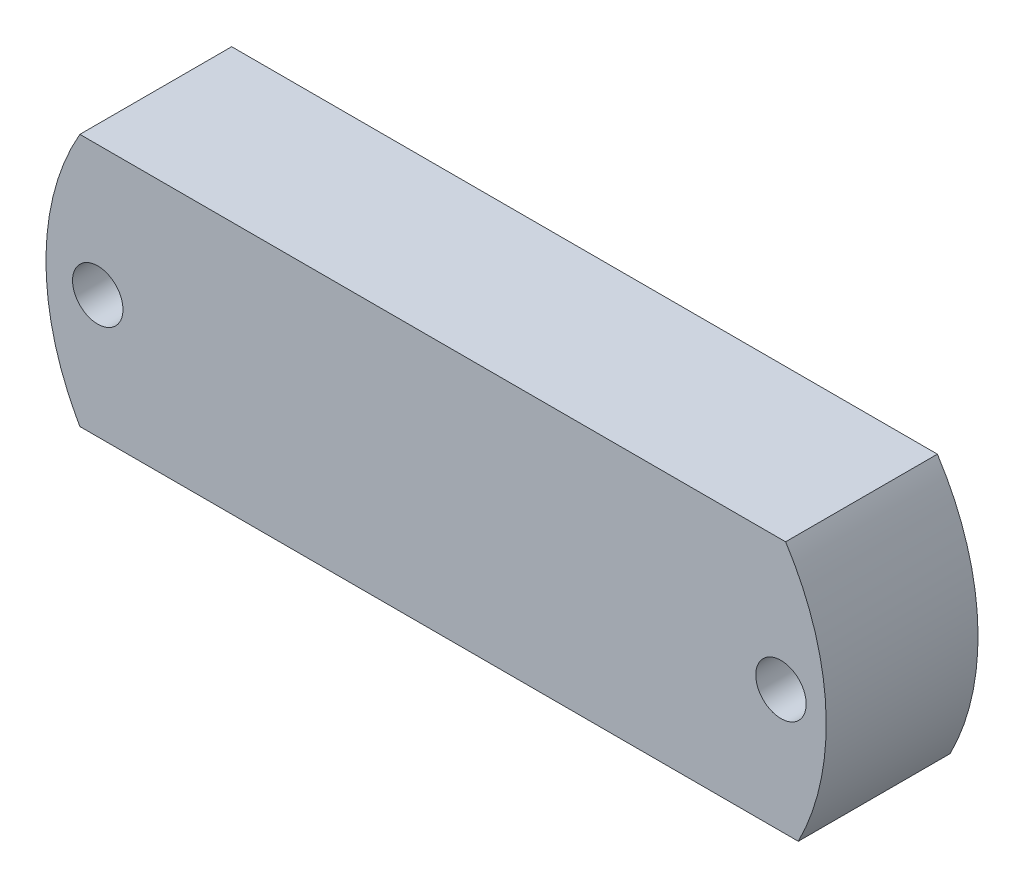
ISO-10303-21;
HEADER;
FILE_DESCRIPTION(('STEP AP214'),'2;1');
FILE_NAME('part.step','',(''),(''),'','','');
FILE_SCHEMA(('AUTOMOTIVE_DESIGN { 1 0 10303 214 1 1 1 1 }'));
ENDSEC;
DATA;
#1=APPLICATION_CONTEXT('core data for automotive mechanical design processes');
#2=APPLICATION_PROTOCOL_DEFINITION('international standard','automotive_design',2000,#1);
#3=PRODUCT_CONTEXT('',#1,'mechanical');
#4=PRODUCT('Part','Part','',(#3));
#5=PRODUCT_RELATED_PRODUCT_CATEGORY('part','',(#4));
#6=PRODUCT_DEFINITION_FORMATION('','',#4);
#7=PRODUCT_DEFINITION_CONTEXT('part definition',#1,'design');
#8=PRODUCT_DEFINITION('design','',#6,#7);
#9=PRODUCT_DEFINITION_SHAPE('','',#8);
#10=(LENGTH_UNIT() NAMED_UNIT(*) SI_UNIT(.MILLI.,.METRE.));
#11=(NAMED_UNIT(*) PLANE_ANGLE_UNIT() SI_UNIT($,.RADIAN.));
#12=(NAMED_UNIT(*) SI_UNIT($,.STERADIAN.) SOLID_ANGLE_UNIT());
#13=UNCERTAINTY_MEASURE_WITH_UNIT(LENGTH_MEASURE(1.E-05),#10,'distance_accuracy_value','');
#14=(GEOMETRIC_REPRESENTATION_CONTEXT(3) GLOBAL_UNCERTAINTY_ASSIGNED_CONTEXT((#13)) GLOBAL_UNIT_ASSIGNED_CONTEXT((#10,
#11,#12)) REPRESENTATION_CONTEXT('',''));
#15=CARTESIAN_POINT('',(0.,0.,0.));
#16=DIRECTION('',(0.,0.,1.));
#17=DIRECTION('',(1.,0.,0.));
#18=AXIS2_PLACEMENT_3D('',#15,#16,#17);
#19=CARTESIAN_POINT('',(0.,0.,11.43));
#20=DIRECTION('',(0.,0.,1.));
#21=DIRECTION('',(1.,0.,0.));
#22=AXIS2_PLACEMENT_3D('',#19,#20,#21);
#23=PLANE('',#22);
#24=CARTESIAN_POINT('',(16.9742327065846,45.0754732211039,11.43));
#25=DIRECTION('',(0.,0.,-1.));
#26=DIRECTION('',(1.,0.,0.));
#27=AXIS2_PLACEMENT_3D('',#24,#25,#26);
#28=CIRCLE('',#27,19.05);
#29=CARTESIAN_POINT('',(32.9659666202389,55.4276201691955,11.43));
#30=VERTEX_POINT('',#29);
#31=CARTESIAN_POINT('',(33.9226796055605,36.3776201691954,11.43));
#32=VERTEX_POINT('',#31);
#33=EDGE_CURVE('E123',#30,#32,#28,.T.);
#34=ORIENTED_EDGE('',*,*,#33,.F.);
#35=DIRECTION('',(1.,0.,0.));
#36=VECTOR('',#35,1.);
#37=CARTESIAN_POINT('',(-35.9792639425507,55.4276201691954,11.43));
#38=LINE('',#37,#36);
#39=CARTESIAN_POINT('',(-20.1644441300956,55.4276201691954,11.43));
#40=VERTEX_POINT('',#39);
#41=EDGE_CURVE('E156',#40,#30,#38,.T.);
#42=ORIENTED_EDGE('',*,*,#41,.F.);
#43=CARTESIAN_POINT('',(-3.66666018800201,45.9026201691955,11.43));
#44=DIRECTION('',(0.,0.,-1.));
#45=DIRECTION('',(-1.,0.,0.));
#46=AXIS2_PLACEMENT_3D('',#43,#44,#45);
#47=CIRCLE('',#46,19.05);
#48=CARTESIAN_POINT('',(-20.4868118319647,36.9591868981244,11.43));
#49=VERTEX_POINT('',#48);
#50=EDGE_CURVE('E67',#49,#40,#47,.T.);
#51=ORIENTED_EDGE('',*,*,#50,.F.);
#52=DIRECTION('',(0.484809620246332,-0.874619707139399,0.));
#53=VECTOR('',#52,1.);
#54=CARTESIAN_POINT('',(0.,0.,11.43));
#55=LINE('',#54,#53);
#56=CARTESIAN_POINT('',(-20.1644441300956,36.3776201691955,11.43));
#57=VERTEX_POINT('',#56);
#58=EDGE_CURVE('E171',#49,#57,#55,.T.);
#59=ORIENTED_EDGE('',*,*,#58,.T.);
#60=DIRECTION('',(-1.,0.,0.));
#61=VECTOR('',#60,1.);
#62=CARTESIAN_POINT('',(-20.1644441300956,36.3776201691954,11.43));
#63=LINE('',#62,#61);
#64=EDGE_CURVE('E153',#32,#57,#63,.T.);
#65=ORIENTED_EDGE('',*,*,#64,.F.);
#66=EDGE_LOOP('',(#34,#42,#51,#59,#65));
#67=FACE_BOUND('',#66,.T.);
#68=CARTESIAN_POINT('',(-18.81632,45.6249806854199,11.43));
#69=DIRECTION('',(0.,0.,-1.));
#70=DIRECTION('',(-1.,0.,0.));
#71=AXIS2_PLACEMENT_3D('',#68,#69,#70);
#72=CIRCLE('',#71,1.89864999999998);
#73=CARTESIAN_POINT('',(-20.71497,45.6249806854199,11.43));
#74=VERTEX_POINT('',#73);
#75=EDGE_CURVE('E188',#74,#74,#72,.T.);
#76=ORIENTED_EDGE('',*,*,#75,.T.);
#77=EDGE_LOOP('',(#76));
#78=FACE_BOUND('',#77,.T.);
#79=CARTESIAN_POINT('',(32.61868,45.6249806854199,11.43));
#80=DIRECTION('',(0.,0.,-1.));
#81=DIRECTION('',(-1.,0.,0.));
#82=AXIS2_PLACEMENT_3D('',#79,#80,#81);
#83=CIRCLE('',#82,1.89864999999999);
#84=CARTESIAN_POINT('',(30.72003,45.6249806854199,11.43));
#85=VERTEX_POINT('',#84);
#86=EDGE_CURVE('E180',#85,#85,#83,.T.);
#87=ORIENTED_EDGE('',*,*,#86,.T.);
#88=EDGE_LOOP('',(#87));
#89=FACE_BOUND('',#88,.T.);
#90=ADVANCED_FACE('F40',(#67,#78,#89),#23,.T.);
#91=CARTESIAN_POINT('',(0.,0.,0.));
#92=DIRECTION('',(0.,0.,1.));
#93=DIRECTION('',(1.,0.,0.));
#94=AXIS2_PLACEMENT_3D('',#91,#92,#93);
#95=PLANE('',#94);
#96=CARTESIAN_POINT('',(32.61868,45.6249806854199,0.));
#97=DIRECTION('',(0.,0.,-1.));
#98=DIRECTION('',(-1.,0.,0.));
#99=AXIS2_PLACEMENT_3D('',#96,#97,#98);
#100=CIRCLE('',#99,1.89864999999999);
#101=CARTESIAN_POINT('',(30.72003,45.6249806854199,0.));
#102=VERTEX_POINT('',#101);
#103=EDGE_CURVE('E174',#102,#102,#100,.T.);
#104=ORIENTED_EDGE('',*,*,#103,.F.);
#105=EDGE_LOOP('',(#104));
#106=FACE_BOUND('',#105,.T.);
#107=CARTESIAN_POINT('',(-18.81632,45.6249806854199,0.));
#108=DIRECTION('',(0.,0.,-1.));
#109=DIRECTION('',(-1.,0.,0.));
#110=AXIS2_PLACEMENT_3D('',#107,#108,#109);
#111=CIRCLE('',#110,1.89864999999999);
#112=CARTESIAN_POINT('',(-20.71497,45.6249806854199,0.));
#113=VERTEX_POINT('',#112);
#114=EDGE_CURVE('E184',#113,#113,#111,.T.);
#115=ORIENTED_EDGE('',*,*,#114,.F.);
#116=EDGE_LOOP('',(#115));
#117=FACE_BOUND('',#116,.T.);
#118=DIRECTION('',(1.,0.,0.));
#119=VECTOR('',#118,1.);
#120=CARTESIAN_POINT('',(-35.9792639425507,55.4276201691954,0.));
#121=LINE('',#120,#119);
#122=CARTESIAN_POINT('',(-20.1644441300956,55.4276201691954,0.));
#123=VERTEX_POINT('',#122);
#124=CARTESIAN_POINT('',(32.9659666202389,55.4276201691955,0.));
#125=VERTEX_POINT('',#124);
#126=EDGE_CURVE('E139',#123,#125,#121,.T.);
#127=ORIENTED_EDGE('',*,*,#126,.T.);
#128=CARTESIAN_POINT('',(16.9742327065846,45.0754732211039,0.));
#129=DIRECTION('',(0.,0.,-1.));
#130=DIRECTION('',(1.,0.,0.));
#131=AXIS2_PLACEMENT_3D('',#128,#129,#130);
#132=CIRCLE('',#131,19.05);
#133=CARTESIAN_POINT('',(33.9226796055605,36.3776201691954,0.));
#134=VERTEX_POINT('',#133);
#135=EDGE_CURVE('E59',#125,#134,#132,.T.);
#136=ORIENTED_EDGE('',*,*,#135,.T.);
#137=DIRECTION('',(-1.,0.,0.));
#138=VECTOR('',#137,1.);
#139=CARTESIAN_POINT('',(-20.1644441300956,36.3776201691954,0.));
#140=LINE('',#139,#138);
#141=CARTESIAN_POINT('',(27.53868,36.3776201691954,0.));
#142=VERTEX_POINT('',#141);
#143=EDGE_CURVE('E130',#134,#142,#140,.T.);
#144=ORIENTED_EDGE('',*,*,#143,.T.);
#145=DIRECTION('',(0.,-1.,0.));
#146=VECTOR('',#145,1.);
#147=CARTESIAN_POINT('',(27.53868,0.,0.));
#148=LINE('',#147,#146);
#149=CARTESIAN_POINT('',(27.53868,54.5149806854199,0.));
#150=VERTEX_POINT('',#149);
#151=EDGE_CURVE('E207',#150,#142,#148,.T.);
#152=ORIENTED_EDGE('',*,*,#151,.F.);
#153=DIRECTION('',(1.,0.,0.));
#154=VECTOR('',#153,1.);
#155=CARTESIAN_POINT('',(0.,54.5149806854199,0.));
#156=LINE('',#155,#154);
#157=CARTESIAN_POINT('',(-13.73632,54.5149806854199,0.));
#158=VERTEX_POINT('',#157);
#159=EDGE_CURVE('E11',#158,#150,#156,.T.);
#160=ORIENTED_EDGE('',*,*,#159,.F.);
#161=DIRECTION('',(0.,1.,0.));
#162=VECTOR('',#161,1.);
#163=CARTESIAN_POINT('',(-13.73632,0.,0.));
#164=LINE('',#163,#162);
#165=CARTESIAN_POINT('',(-13.73632,36.3776201691954,0.));
#166=VERTEX_POINT('',#165);
#167=EDGE_CURVE('E49',#166,#158,#164,.T.);
#168=ORIENTED_EDGE('',*,*,#167,.F.);
#169=CARTESIAN_POINT('',(-20.1644441300956,36.3776201691954,0.));
#170=VERTEX_POINT('',#169);
#171=EDGE_CURVE('E147',#166,#170,#140,.T.);
#172=ORIENTED_EDGE('',*,*,#171,.T.);
#173=DIRECTION('',(0.484809620246332,-0.874619707139399,0.));
#174=VECTOR('',#173,1.);
#175=CARTESIAN_POINT('',(0.,0.,0.));
#176=LINE('',#175,#174);
#177=CARTESIAN_POINT('',(-20.4868118319647,36.9591868981244,0.));
#178=VERTEX_POINT('',#177);
#179=EDGE_CURVE('E170',#178,#170,#176,.T.);
#180=ORIENTED_EDGE('',*,*,#179,.F.);
#181=CARTESIAN_POINT('',(-3.66666018800201,45.9026201691955,0.));
#182=DIRECTION('',(0.,0.,-1.));
#183=DIRECTION('',(-1.,0.,0.));
#184=AXIS2_PLACEMENT_3D('',#181,#182,#183);
#185=CIRCLE('',#184,19.05);
#186=EDGE_CURVE('E227',#178,#123,#185,.T.);
#187=ORIENTED_EDGE('',*,*,#186,.T.);
#188=EDGE_LOOP('',(#127,#136,#144,#152,#160,#168,#172,#180,#187));
#189=FACE_BOUND('',#188,.T.);
#190=ADVANCED_FACE('F42',(#106,#117,#189),#95,.F.);
#191=CARTESIAN_POINT('',(-13.73632,28.9424018104892,-2.20114598436374));
#192=DIRECTION('',(1.,0.,0.));
#193=DIRECTION('',(0.,1.,0.));
#194=AXIS2_PLACEMENT_3D('',#191,#192,#193);
#195=PLANE('',#194);
#196=DIRECTION('',(0.,0.,1.));
#197=VECTOR('',#196,1.);
#198=CARTESIAN_POINT('',(-13.73632,36.3776201691954,-2.20114598436374));
#199=LINE('',#198,#197);
#200=CARTESIAN_POINT('',(-13.73632,36.3776201691954,1.10922651046495));
#201=VERTEX_POINT('',#200);
#202=EDGE_CURVE('E168',#166,#201,#199,.T.);
#203=ORIENTED_EDGE('',*,*,#202,.F.);
#204=ORIENTED_EDGE('',*,*,#167,.T.);
#205=DIRECTION('',(0.,0.406736643075801,-0.913545457642601));
#206=VECTOR('',#205,1.);
#207=CARTESIAN_POINT('',(-13.73632,51.1022739765257,7.66506476672597));
#208=LINE('',#207,#206);
#209=CARTESIAN_POINT('',(-13.73632,51.1022739765257,7.66506476672597));
#210=VERTEX_POINT('',#209);
#211=EDGE_CURVE('E200',#210,#158,#208,.T.);
#212=ORIENTED_EDGE('',*,*,#211,.F.);
#213=DIRECTION('',(0.,-0.9135454576426,-0.406736643075801));
#214=VECTOR('',#213,1.);
#215=CARTESIAN_POINT('',(-13.73632,28.9424018104892,-2.20114598436374));
#216=LINE('',#215,#214);
#217=EDGE_CURVE('E192',#210,#201,#216,.T.);
#218=ORIENTED_EDGE('',*,*,#217,.T.);
#219=EDGE_LOOP('',(#203,#204,#212,#218));
#220=FACE_BOUND('',#219,.T.);
#221=ADVANCED_FACE('F213',(#220),#195,.T.);
#222=CARTESIAN_POINT('',(27.53868,28.9424018104892,-2.20114598436374));
#223=DIRECTION('',(-1.,0.,0.));
#224=DIRECTION('',(0.,0.,1.));
#225=AXIS2_PLACEMENT_3D('',#222,#223,#224);
#226=PLANE('',#225);
#227=DIRECTION('',(0.,0.,-1.));
#228=VECTOR('',#227,1.);
#229=CARTESIAN_POINT('',(27.53868,36.3776201691954,-2.20114598436374));
#230=LINE('',#229,#228);
#231=CARTESIAN_POINT('',(27.53868,36.3776201691954,1.10922651046495));
#232=VERTEX_POINT('',#231);
#233=EDGE_CURVE('E145',#232,#142,#230,.T.);
#234=ORIENTED_EDGE('',*,*,#233,.F.);
#235=DIRECTION('',(0.,0.913545457642601,0.406736643075801));
#236=VECTOR('',#235,1.);
#237=CARTESIAN_POINT('',(27.53868,28.9424018104892,-2.20114598436374));
#238=LINE('',#237,#236);
#239=CARTESIAN_POINT('',(27.53868,51.1022739765257,7.66506476672597));
#240=VERTEX_POINT('',#239);
#241=EDGE_CURVE('E195',#232,#240,#238,.T.);
#242=ORIENTED_EDGE('',*,*,#241,.T.);
#243=DIRECTION('',(0.,0.406736643075801,-0.913545457642601));
#244=VECTOR('',#243,1.);
#245=CARTESIAN_POINT('',(27.53868,51.1022739765257,7.66506476672597));
#246=LINE('',#245,#244);
#247=EDGE_CURVE('E203',#240,#150,#246,.T.);
#248=ORIENTED_EDGE('',*,*,#247,.T.);
#249=ORIENTED_EDGE('',*,*,#151,.T.);
#250=EDGE_LOOP('',(#234,#242,#248,#249));
#251=FACE_BOUND('',#250,.T.);
#252=ADVANCED_FACE('F221',(#251),#226,.T.);
#253=CARTESIAN_POINT('',(27.53868,51.1022739765257,7.66506476672597));
#254=DIRECTION('',(0.,-0.913545457642601,-0.406736643075801));
#255=DIRECTION('',(0.,0.406736643075801,-0.913545457642601));
#256=AXIS2_PLACEMENT_3D('',#253,#254,#255);
#257=PLANE('',#256);
#258=ORIENTED_EDGE('',*,*,#159,.T.);
#259=ORIENTED_EDGE('',*,*,#247,.F.);
#260=DIRECTION('',(-1.,0.,0.));
#261=VECTOR('',#260,1.);
#262=CARTESIAN_POINT('',(27.53868,51.1022739765257,7.66506476672597));
#263=LINE('',#262,#261);
#264=EDGE_CURVE('E197',#240,#210,#263,.T.);
#265=ORIENTED_EDGE('',*,*,#264,.T.);
#266=ORIENTED_EDGE('',*,*,#211,.T.);
#267=EDGE_LOOP('',(#258,#259,#265,#266));
#268=FACE_BOUND('',#267,.T.);
#269=ADVANCED_FACE('F217',(#268),#257,.T.);
#270=CARTESIAN_POINT('',(0.,5.60596259297757,-12.591198136959));
#271=DIRECTION('',(0.,-0.406736643075801,0.913545457642601));
#272=DIRECTION('',(0.,-0.913545457642601,-0.406736643075801));
#273=AXIS2_PLACEMENT_3D('',#270,#271,#272);
#274=PLANE('',#273);
#275=ORIENTED_EDGE('',*,*,#241,.F.);
#276=DIRECTION('',(-1.,0.,0.));
#277=VECTOR('',#276,1.);
#278=CARTESIAN_POINT('',(0.,36.3776201691954,1.10922651046495));
#279=LINE('',#278,#277);
#280=EDGE_CURVE('E162',#232,#201,#279,.T.);
#281=ORIENTED_EDGE('',*,*,#280,.T.);
#282=ORIENTED_EDGE('',*,*,#217,.F.);
#283=ORIENTED_EDGE('',*,*,#264,.F.);
#284=EDGE_LOOP('',(#275,#281,#282,#283));
#285=FACE_BOUND('',#284,.T.);
#286=ADVANCED_FACE('F224',(#285),#274,.F.);
#287=CARTESIAN_POINT('',(-18.81632,45.6249806854199,0.));
#288=DIRECTION('',(0.,0.,-1.));
#289=DIRECTION('',(-1.,0.,0.));
#290=AXIS2_PLACEMENT_3D('',#287,#288,#289);
#291=CYLINDRICAL_SURFACE('',#290,1.89864999999999);
#292=ORIENTED_EDGE('',*,*,#75,.F.);
#293=EDGE_LOOP('',(#292));
#294=FACE_BOUND('',#293,.T.);
#295=ORIENTED_EDGE('',*,*,#114,.T.);
#296=EDGE_LOOP('',(#295));
#297=FACE_BOUND('',#296,.T.);
#298=ADVANCED_FACE('F275',(#294,#297),#291,.F.);
#299=CARTESIAN_POINT('',(32.61868,45.6249806854199,0.));
#300=DIRECTION('',(0.,0.,-1.));
#301=DIRECTION('',(-1.,0.,0.));
#302=AXIS2_PLACEMENT_3D('',#299,#300,#301);
#303=CYLINDRICAL_SURFACE('',#302,1.89864999999999);
#304=ORIENTED_EDGE('',*,*,#86,.F.);
#305=EDGE_LOOP('',(#304));
#306=FACE_BOUND('',#305,.T.);
#307=ORIENTED_EDGE('',*,*,#103,.T.);
#308=EDGE_LOOP('',(#307));
#309=FACE_BOUND('',#308,.T.);
#310=ADVANCED_FACE('F278',(#306,#309),#303,.F.);
#311=CARTESIAN_POINT('',(0.,0.,11.43));
#312=DIRECTION('',(0.874619707139399,0.484809620246332,0.));
#313=DIRECTION('',(-0.484809620246332,0.874619707139399,0.));
#314=AXIS2_PLACEMENT_3D('',#311,#312,#313);
#315=PLANE('',#314);
#316=ORIENTED_EDGE('',*,*,#58,.F.);
#317=DIRECTION('',(0.,0.,1.));
#318=VECTOR('',#317,1.);
#319=CARTESIAN_POINT('',(-20.4868118319647,36.9591868981244,0.));
#320=LINE('',#319,#318);
#321=EDGE_CURVE('E232',#49,#178,#320,.F.);
#322=ORIENTED_EDGE('',*,*,#321,.T.);
#323=ORIENTED_EDGE('',*,*,#179,.T.);
#324=DIRECTION('',(0.,0.,1.));
#325=VECTOR('',#324,1.);
#326=CARTESIAN_POINT('',(-20.1644441300956,36.3776201691954,0.));
#327=LINE('',#326,#325);
#328=EDGE_CURVE('E129',#170,#57,#327,.T.);
#329=ORIENTED_EDGE('',*,*,#328,.T.);
#330=EDGE_LOOP('',(#316,#322,#323,#329));
#331=FACE_BOUND('',#330,.T.);
#332=ADVANCED_FACE('F231',(#331),#315,.F.);
#333=CARTESIAN_POINT('',(-20.1644441300956,36.3776201691954,0.));
#334=DIRECTION('',(0.,1.,0.));
#335=DIRECTION('',(-1.,0.,0.));
#336=AXIS2_PLACEMENT_3D('',#333,#334,#335);
#337=PLANE('',#336);
#338=ORIENTED_EDGE('',*,*,#202,.T.);
#339=ORIENTED_EDGE('',*,*,#280,.F.);
#340=ORIENTED_EDGE('',*,*,#233,.T.);
#341=ORIENTED_EDGE('',*,*,#143,.F.);
#342=DIRECTION('',(0.,0.,1.));
#343=VECTOR('',#342,1.);
#344=CARTESIAN_POINT('',(33.9226796055605,36.3776201691954,0.));
#345=LINE('',#344,#343);
#346=EDGE_CURVE('E120',#134,#32,#345,.T.);
#347=ORIENTED_EDGE('',*,*,#346,.T.);
#348=ORIENTED_EDGE('',*,*,#64,.T.);
#349=ORIENTED_EDGE('',*,*,#328,.F.);
#350=ORIENTED_EDGE('',*,*,#171,.F.);
#351=EDGE_LOOP('',(#338,#339,#340,#341,#347,#348,#349,#350));
#352=FACE_BOUND('',#351,.T.);
#353=ADVANCED_FACE('F143',(#352),#337,.F.);
#354=CARTESIAN_POINT('',(-35.9792639425507,55.4276201691954,0.));
#355=DIRECTION('',(0.,-1.,0.));
#356=DIRECTION('',(1.,0.,0.));
#357=AXIS2_PLACEMENT_3D('',#354,#355,#356);
#358=PLANE('',#357);
#359=ORIENTED_EDGE('',*,*,#41,.T.);
#360=DIRECTION('',(0.,0.,1.));
#361=VECTOR('',#360,1.);
#362=CARTESIAN_POINT('',(32.9659666202389,55.4276201691955,0.));
#363=LINE('',#362,#361);
#364=EDGE_CURVE('E141',#125,#30,#363,.T.);
#365=ORIENTED_EDGE('',*,*,#364,.F.);
#366=ORIENTED_EDGE('',*,*,#126,.F.);
#367=DIRECTION('',(0.,0.,1.));
#368=VECTOR('',#367,1.);
#369=CARTESIAN_POINT('',(-20.1644441300956,55.4276201691954,0.));
#370=LINE('',#369,#368);
#371=EDGE_CURVE('E234',#123,#40,#370,.T.);
#372=ORIENTED_EDGE('',*,*,#371,.T.);
#373=EDGE_LOOP('',(#359,#365,#366,#372));
#374=FACE_BOUND('',#373,.T.);
#375=ADVANCED_FACE('F251',(#374),#358,.F.);
#376=CARTESIAN_POINT('',(-3.66666018800201,45.9026201691955,0.));
#377=DIRECTION('',(0.,0.,1.));
#378=DIRECTION('',(1.,0.,0.));
#379=AXIS2_PLACEMENT_3D('',#376,#377,#378);
#380=CYLINDRICAL_SURFACE('',#379,19.05);
#381=ORIENTED_EDGE('',*,*,#50,.T.);
#382=ORIENTED_EDGE('',*,*,#371,.F.);
#383=ORIENTED_EDGE('',*,*,#186,.F.);
#384=ORIENTED_EDGE('',*,*,#321,.F.);
#385=EDGE_LOOP('',(#381,#382,#383,#384));
#386=FACE_BOUND('',#385,.T.);
#387=ADVANCED_FACE('F252',(#386),#380,.T.);
#388=CARTESIAN_POINT('',(16.9742327065846,45.0754732211039,0.));
#389=DIRECTION('',(0.,0.,1.));
#390=DIRECTION('',(1.,0.,0.));
#391=AXIS2_PLACEMENT_3D('',#388,#389,#390);
#392=CYLINDRICAL_SURFACE('',#391,19.05);
#393=ORIENTED_EDGE('',*,*,#33,.T.);
#394=ORIENTED_EDGE('',*,*,#346,.F.);
#395=ORIENTED_EDGE('',*,*,#135,.F.);
#396=ORIENTED_EDGE('',*,*,#364,.T.);
#397=EDGE_LOOP('',(#393,#394,#395,#396));
#398=FACE_BOUND('',#397,.T.);
#399=ADVANCED_FACE('F121',(#398),#392,.T.);
#400=CLOSED_SHELL('',(#90,#190,#221,#252,#269,#286,#298,#310,#332,#353,#375,#387,#399));
#401=MANIFOLD_SOLID_BREP('B2',#400);
#402=ADVANCED_BREP_SHAPE_REPRESENTATION('',(#18,#401),#14);
#403=SHAPE_DEFINITION_REPRESENTATION(#9,#402);
ENDSEC;
END-ISO-10303-21;
